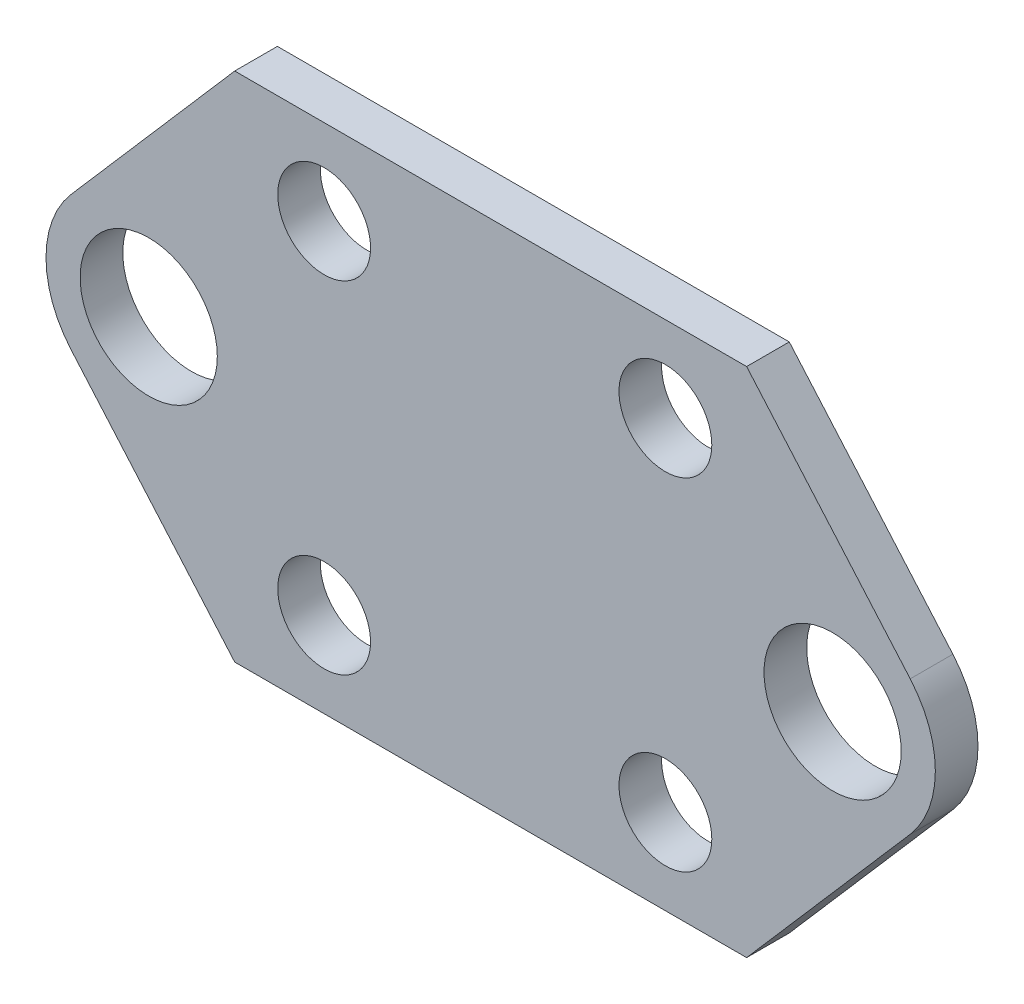
ISO-10303-21;
HEADER;
FILE_DESCRIPTION(('STEP AP214'),'2;1');
FILE_NAME('part.step','',(''),(''),'','','');
FILE_SCHEMA(('AUTOMOTIVE_DESIGN { 1 0 10303 214 1 1 1 1 }'));
ENDSEC;
DATA;
#1=APPLICATION_CONTEXT('core data for automotive mechanical design processes');
#2=APPLICATION_PROTOCOL_DEFINITION('international standard','automotive_design',2000,#1);
#3=PRODUCT_CONTEXT('',#1,'mechanical');
#4=PRODUCT('Part','Part','',(#3));
#5=PRODUCT_RELATED_PRODUCT_CATEGORY('part','',(#4));
#6=PRODUCT_DEFINITION_FORMATION('','',#4);
#7=PRODUCT_DEFINITION_CONTEXT('part definition',#1,'design');
#8=PRODUCT_DEFINITION('design','',#6,#7);
#9=PRODUCT_DEFINITION_SHAPE('','',#8);
#10=(LENGTH_UNIT() NAMED_UNIT(*) SI_UNIT(.MILLI.,.METRE.));
#11=(NAMED_UNIT(*) PLANE_ANGLE_UNIT() SI_UNIT($,.RADIAN.));
#12=(NAMED_UNIT(*) SI_UNIT($,.STERADIAN.) SOLID_ANGLE_UNIT());
#13=UNCERTAINTY_MEASURE_WITH_UNIT(LENGTH_MEASURE(1.E-05),#10,'distance_accuracy_value','');
#14=(GEOMETRIC_REPRESENTATION_CONTEXT(3) GLOBAL_UNCERTAINTY_ASSIGNED_CONTEXT((#13)) GLOBAL_UNIT_ASSIGNED_CONTEXT((#10,
#11,#12)) REPRESENTATION_CONTEXT('',''));
#15=CARTESIAN_POINT('',(0.,0.,0.));
#16=DIRECTION('',(0.,0.,1.));
#17=DIRECTION('',(1.,0.,0.));
#18=AXIS2_PLACEMENT_3D('',#15,#16,#17);
#19=CARTESIAN_POINT('',(-10.1509508913953,-8.80321893244519,0.79375));
#20=DIRECTION('',(0.755478050282948,0.655173958228404,0.));
#21=DIRECTION('',(-0.655173958228405,0.755478050282948,0.));
#22=AXIS2_PLACEMENT_3D('',#19,#20,#21);
#23=PLANE('',#22);
#24=DIRECTION('',(0.655173958228405,-0.755478050282948,0.));
#25=VECTOR('',#24,1.);
#26=CARTESIAN_POINT('',(-10.1509508913953,-8.80321893244519,-0.79375));
#27=LINE('',#26,#25);
#28=CARTESIAN_POINT('',(-15.6133659428166,-2.50453349011973,-0.79375));
#29=VERTEX_POINT('',#28);
#30=CARTESIAN_POINT('',(-9.525,-9.525,-0.79375));
#31=VERTEX_POINT('',#30);
#32=EDGE_CURVE('E167',#29,#31,#27,.T.);
#33=ORIENTED_EDGE('',*,*,#32,.T.);
#34=DIRECTION('',(0.,0.,-1.));
#35=VECTOR('',#34,1.);
#36=CARTESIAN_POINT('',(-9.525,-9.525,0.79375));
#37=LINE('',#36,#35);
#38=CARTESIAN_POINT('',(-9.525,-9.525,0.79375));
#39=VERTEX_POINT('',#38);
#40=EDGE_CURVE('E11',#39,#31,#37,.T.);
#41=ORIENTED_EDGE('',*,*,#40,.F.);
#42=DIRECTION('',(0.655173958228405,-0.755478050282948,0.));
#43=VECTOR('',#42,1.);
#44=CARTESIAN_POINT('',(-10.1509508913953,-8.80321893244519,0.79375));
#45=LINE('',#44,#43);
#46=CARTESIAN_POINT('',(-15.6133659428166,-2.50453349011973,0.79375));
#47=VERTEX_POINT('',#46);
#48=EDGE_CURVE('E250',#47,#39,#45,.T.);
#49=ORIENTED_EDGE('',*,*,#48,.F.);
#50=DIRECTION('',(0.,0.,-1.));
#51=VECTOR('',#50,1.);
#52=CARTESIAN_POINT('',(-15.6133659428166,-2.50453349011973,0.79375));
#53=LINE('',#52,#51);
#54=EDGE_CURVE('E162',#47,#29,#53,.T.);
#55=ORIENTED_EDGE('',*,*,#54,.T.);
#56=EDGE_LOOP('',(#33,#41,#49,#55));
#57=FACE_BOUND('',#56,.T.);
#58=ADVANCED_FACE('F41',(#57),#23,.F.);
#59=CARTESIAN_POINT('',(0.,-9.525,0.79375));
#60=DIRECTION('',(0.,1.,0.));
#61=DIRECTION('',(0.,0.,1.));
#62=AXIS2_PLACEMENT_3D('',#59,#60,#61);
#63=PLANE('',#62);
#64=DIRECTION('',(1.,0.,0.));
#65=VECTOR('',#64,1.);
#66=CARTESIAN_POINT('',(0.,-9.525,-0.79375));
#67=LINE('',#66,#65);
#68=CARTESIAN_POINT('',(9.525,-9.525,-0.79375));
#69=VERTEX_POINT('',#68);
#70=EDGE_CURVE('E171',#31,#69,#67,.T.);
#71=ORIENTED_EDGE('',*,*,#70,.T.);
#72=DIRECTION('',(0.,0.,-1.));
#73=VECTOR('',#72,1.);
#74=CARTESIAN_POINT('',(9.525,-9.525,0.79375));
#75=LINE('',#74,#73);
#76=CARTESIAN_POINT('',(9.525,-9.525,0.79375));
#77=VERTEX_POINT('',#76);
#78=EDGE_CURVE('E51',#77,#69,#75,.T.);
#79=ORIENTED_EDGE('',*,*,#78,.F.);
#80=DIRECTION('',(1.,0.,0.));
#81=VECTOR('',#80,1.);
#82=CARTESIAN_POINT('',(0.,-9.525,0.79375));
#83=LINE('',#82,#81);
#84=EDGE_CURVE('E98',#39,#77,#83,.T.);
#85=ORIENTED_EDGE('',*,*,#84,.F.);
#86=ORIENTED_EDGE('',*,*,#40,.T.);
#87=EDGE_LOOP('',(#71,#79,#85,#86));
#88=FACE_BOUND('',#87,.T.);
#89=ADVANCED_FACE('F233',(#88),#63,.F.);
#90=CARTESIAN_POINT('',(10.1509508913953,-8.80321893244518,0.79375));
#91=DIRECTION('',(0.755478050282949,-0.655173958228404,0.));
#92=DIRECTION('',(0.655173958228404,0.755478050282949,0.));
#93=AXIS2_PLACEMENT_3D('',#90,#91,#92);
#94=PLANE('',#93);
#95=DIRECTION('',(-0.655173958228404,-0.755478050282949,0.));
#96=VECTOR('',#95,1.);
#97=CARTESIAN_POINT('',(10.1509508913953,-8.80321893244518,-0.79375));
#98=LINE('',#97,#96);
#99=CARTESIAN_POINT('',(15.6133659428166,-2.50453349011972,-0.79375));
#100=VERTEX_POINT('',#99);
#101=EDGE_CURVE('E175',#100,#69,#98,.T.);
#102=ORIENTED_EDGE('',*,*,#101,.F.);
#103=DIRECTION('',(0.,0.,-1.));
#104=VECTOR('',#103,1.);
#105=CARTESIAN_POINT('',(15.6133659428166,-2.50453349011972,0.79375));
#106=LINE('',#105,#104);
#107=CARTESIAN_POINT('',(15.6133659428166,-2.50453349011972,0.79375));
#108=VERTEX_POINT('',#107);
#109=EDGE_CURVE('E224',#108,#100,#106,.T.);
#110=ORIENTED_EDGE('',*,*,#109,.F.);
#111=DIRECTION('',(-0.655173958228404,-0.755478050282949,0.));
#112=VECTOR('',#111,1.);
#113=CARTESIAN_POINT('',(10.1509508913953,-8.80321893244518,0.79375));
#114=LINE('',#113,#112);
#115=EDGE_CURVE('E232',#108,#77,#114,.T.);
#116=ORIENTED_EDGE('',*,*,#115,.T.);
#117=ORIENTED_EDGE('',*,*,#78,.T.);
#118=EDGE_LOOP('',(#102,#110,#116,#117));
#119=FACE_BOUND('',#118,.T.);
#120=ADVANCED_FACE('F230',(#119),#94,.T.);
#121=CARTESIAN_POINT('',(12.7254,0.,0.79375));
#122=DIRECTION('',(0.,0.,-1.));
#123=DIRECTION('',(-1.,0.,0.));
#124=AXIS2_PLACEMENT_3D('',#121,#122,#123);
#125=CYLINDRICAL_SURFACE('',#124,3.8227);
#126=CARTESIAN_POINT('',(12.7254,0.,-0.79375));
#127=DIRECTION('',(0.,0.,1.));
#128=DIRECTION('',(1.,0.,0.));
#129=AXIS2_PLACEMENT_3D('',#126,#127,#128);
#130=CIRCLE('',#129,3.8227);
#131=CARTESIAN_POINT('',(15.6133659428166,2.50453349011973,-0.79375));
#132=VERTEX_POINT('',#131);
#133=EDGE_CURVE('E179',#132,#100,#130,.F.);
#134=ORIENTED_EDGE('',*,*,#133,.F.);
#135=DIRECTION('',(0.,0.,-1.));
#136=VECTOR('',#135,1.);
#137=CARTESIAN_POINT('',(15.6133659428166,2.50453349011973,0.79375));
#138=LINE('',#137,#136);
#139=CARTESIAN_POINT('',(15.6133659428166,2.50453349011973,0.79375));
#140=VERTEX_POINT('',#139);
#141=EDGE_CURVE('E221',#140,#132,#138,.T.);
#142=ORIENTED_EDGE('',*,*,#141,.F.);
#143=CARTESIAN_POINT('',(12.7254,0.,0.79375));
#144=DIRECTION('',(0.,0.,1.));
#145=DIRECTION('',(1.,0.,0.));
#146=AXIS2_PLACEMENT_3D('',#143,#144,#145);
#147=CIRCLE('',#146,3.8227);
#148=EDGE_CURVE('E244',#140,#108,#147,.F.);
#149=ORIENTED_EDGE('',*,*,#148,.T.);
#150=ORIENTED_EDGE('',*,*,#109,.T.);
#151=EDGE_LOOP('',(#134,#142,#149,#150));
#152=FACE_BOUND('',#151,.T.);
#153=ADVANCED_FACE('F242',(#152),#125,.T.);
#154=CARTESIAN_POINT('',(10.1509508913953,8.80321893244518,0.79375));
#155=DIRECTION('',(-0.755478050282949,-0.655173958228404,0.));
#156=DIRECTION('',(0.655173958228404,-0.755478050282949,0.));
#157=AXIS2_PLACEMENT_3D('',#154,#155,#156);
#158=PLANE('',#157);
#159=DIRECTION('',(-0.655173958228404,0.755478050282949,0.));
#160=VECTOR('',#159,1.);
#161=CARTESIAN_POINT('',(10.1509508913953,8.80321893244518,-0.79375));
#162=LINE('',#161,#160);
#163=CARTESIAN_POINT('',(9.525,9.525,-0.79375));
#164=VERTEX_POINT('',#163);
#165=EDGE_CURVE('E183',#132,#164,#162,.T.);
#166=ORIENTED_EDGE('',*,*,#165,.T.);
#167=DIRECTION('',(0.,0.,-1.));
#168=VECTOR('',#167,1.);
#169=CARTESIAN_POINT('',(9.525,9.525,0.79375));
#170=LINE('',#169,#168);
#171=CARTESIAN_POINT('',(9.525,9.525,0.79375));
#172=VERTEX_POINT('',#171);
#173=EDGE_CURVE('E124',#172,#164,#170,.T.);
#174=ORIENTED_EDGE('',*,*,#173,.F.);
#175=DIRECTION('',(-0.655173958228404,0.755478050282949,0.));
#176=VECTOR('',#175,1.);
#177=CARTESIAN_POINT('',(10.1509508913953,8.80321893244518,0.79375));
#178=LINE('',#177,#176);
#179=EDGE_CURVE('E131',#140,#172,#178,.T.);
#180=ORIENTED_EDGE('',*,*,#179,.F.);
#181=ORIENTED_EDGE('',*,*,#141,.T.);
#182=EDGE_LOOP('',(#166,#174,#180,#181));
#183=FACE_BOUND('',#182,.T.);
#184=ADVANCED_FACE('F284',(#183),#158,.F.);
#185=CARTESIAN_POINT('',(0.,9.525,0.79375));
#186=DIRECTION('',(0.,1.,0.));
#187=DIRECTION('',(0.,0.,1.));
#188=AXIS2_PLACEMENT_3D('',#185,#186,#187);
#189=PLANE('',#188);
#190=DIRECTION('',(1.,0.,0.));
#191=VECTOR('',#190,1.);
#192=CARTESIAN_POINT('',(0.,9.525,-0.79375));
#193=LINE('',#192,#191);
#194=CARTESIAN_POINT('',(-9.525,9.525,-0.79375));
#195=VERTEX_POINT('',#194);
#196=EDGE_CURVE('E118',#195,#164,#193,.T.);
#197=ORIENTED_EDGE('',*,*,#196,.F.);
#198=DIRECTION('',(0.,0.,-1.));
#199=VECTOR('',#198,1.);
#200=CARTESIAN_POINT('',(-9.525,9.525,0.79375));
#201=LINE('',#200,#199);
#202=CARTESIAN_POINT('',(-9.525,9.525,0.79375));
#203=VERTEX_POINT('',#202);
#204=EDGE_CURVE('E113',#203,#195,#201,.T.);
#205=ORIENTED_EDGE('',*,*,#204,.F.);
#206=DIRECTION('',(1.,0.,0.));
#207=VECTOR('',#206,1.);
#208=CARTESIAN_POINT('',(0.,9.525,0.79375));
#209=LINE('',#208,#207);
#210=EDGE_CURVE('E116',#203,#172,#209,.T.);
#211=ORIENTED_EDGE('',*,*,#210,.T.);
#212=ORIENTED_EDGE('',*,*,#173,.T.);
#213=EDGE_LOOP('',(#197,#205,#211,#212));
#214=FACE_BOUND('',#213,.T.);
#215=ADVANCED_FACE('F115',(#214),#189,.T.);
#216=CARTESIAN_POINT('',(-10.1509508913953,8.80321893244518,0.79375));
#217=DIRECTION('',(-0.755478050282949,0.655173958228404,0.));
#218=DIRECTION('',(-0.655173958228404,-0.755478050282949,0.));
#219=AXIS2_PLACEMENT_3D('',#216,#217,#218);
#220=PLANE('',#219);
#221=DIRECTION('',(0.655173958228404,0.755478050282949,0.));
#222=VECTOR('',#221,1.);
#223=CARTESIAN_POINT('',(-10.1509508913953,8.80321893244518,-0.79375));
#224=LINE('',#223,#222);
#225=CARTESIAN_POINT('',(-15.6133659428166,2.50453349011972,-0.79375));
#226=VERTEX_POINT('',#225);
#227=EDGE_CURVE('E189',#226,#195,#224,.T.);
#228=ORIENTED_EDGE('',*,*,#227,.F.);
#229=DIRECTION('',(0.,0.,-1.));
#230=VECTOR('',#229,1.);
#231=CARTESIAN_POINT('',(-15.6133659428166,2.50453349011972,0.79375));
#232=LINE('',#231,#230);
#233=CARTESIAN_POINT('',(-15.6133659428166,2.50453349011972,0.79375));
#234=VERTEX_POINT('',#233);
#235=EDGE_CURVE('E87',#234,#226,#232,.T.);
#236=ORIENTED_EDGE('',*,*,#235,.F.);
#237=DIRECTION('',(0.655173958228404,0.755478050282949,0.));
#238=VECTOR('',#237,1.);
#239=CARTESIAN_POINT('',(-10.1509508913953,8.80321893244518,0.79375));
#240=LINE('',#239,#238);
#241=EDGE_CURVE('E128',#234,#203,#240,.T.);
#242=ORIENTED_EDGE('',*,*,#241,.T.);
#243=ORIENTED_EDGE('',*,*,#204,.T.);
#244=EDGE_LOOP('',(#228,#236,#242,#243));
#245=FACE_BOUND('',#244,.T.);
#246=ADVANCED_FACE('F135',(#245),#220,.T.);
#247=CARTESIAN_POINT('',(6.5024,-6.35,0.79375));
#248=DIRECTION('',(0.,0.,-1.));
#249=DIRECTION('',(-1.,0.,0.));
#250=AXIS2_PLACEMENT_3D('',#247,#248,#249);
#251=CYLINDRICAL_SURFACE('',#250,1.7272);
#252=CARTESIAN_POINT('',(6.5024,-6.35,0.79375));
#253=DIRECTION('',(0.,0.,1.));
#254=DIRECTION('',(1.,0.,0.));
#255=AXIS2_PLACEMENT_3D('',#252,#253,#254);
#256=CIRCLE('',#255,1.7272);
#257=CARTESIAN_POINT('',(8.2296,-6.35,0.79375));
#258=VERTEX_POINT('',#257);
#259=EDGE_CURVE('E154',#258,#258,#256,.F.);
#260=ORIENTED_EDGE('',*,*,#259,.F.);
#261=EDGE_LOOP('',(#260));
#262=FACE_BOUND('',#261,.T.);
#263=CARTESIAN_POINT('',(6.5024,-6.35,-0.79375));
#264=DIRECTION('',(0.,0.,1.));
#265=DIRECTION('',(1.,0.,0.));
#266=AXIS2_PLACEMENT_3D('',#263,#264,#265);
#267=CIRCLE('',#266,1.7272);
#268=CARTESIAN_POINT('',(8.2296,-6.35,-0.79375));
#269=VERTEX_POINT('',#268);
#270=EDGE_CURVE('E206',#269,#269,#267,.F.);
#271=ORIENTED_EDGE('',*,*,#270,.T.);
#272=EDGE_LOOP('',(#271));
#273=FACE_BOUND('',#272,.T.);
#274=ADVANCED_FACE('F292',(#262,#273),#251,.F.);
#275=CARTESIAN_POINT('',(-6.1976,6.35,0.79375));
#276=DIRECTION('',(0.,0.,-1.));
#277=DIRECTION('',(-1.,0.,0.));
#278=AXIS2_PLACEMENT_3D('',#275,#276,#277);
#279=CYLINDRICAL_SURFACE('',#278,1.7272);
#280=CARTESIAN_POINT('',(-6.1976,6.35,0.79375));
#281=DIRECTION('',(0.,0.,1.));
#282=DIRECTION('',(1.,0.,0.));
#283=AXIS2_PLACEMENT_3D('',#280,#281,#282);
#284=CIRCLE('',#283,1.7272);
#285=CARTESIAN_POINT('',(-4.4704,6.35,0.79375));
#286=VERTEX_POINT('',#285);
#287=EDGE_CURVE('E150',#286,#286,#284,.T.);
#288=ORIENTED_EDGE('',*,*,#287,.T.);
#289=EDGE_LOOP('',(#288));
#290=FACE_BOUND('',#289,.T.);
#291=CARTESIAN_POINT('',(-6.1976,6.35,-0.79375));
#292=DIRECTION('',(0.,0.,1.));
#293=DIRECTION('',(1.,0.,0.));
#294=AXIS2_PLACEMENT_3D('',#291,#292,#293);
#295=CIRCLE('',#294,1.7272);
#296=CARTESIAN_POINT('',(-4.4704,6.35,-0.79375));
#297=VERTEX_POINT('',#296);
#298=EDGE_CURVE('E202',#297,#297,#295,.T.);
#299=ORIENTED_EDGE('',*,*,#298,.F.);
#300=EDGE_LOOP('',(#299));
#301=FACE_BOUND('',#300,.T.);
#302=ADVANCED_FACE('F303',(#290,#301),#279,.F.);
#303=CARTESIAN_POINT('',(6.5024,6.35,0.79375));
#304=DIRECTION('',(0.,0.,-1.));
#305=DIRECTION('',(-1.,0.,0.));
#306=AXIS2_PLACEMENT_3D('',#303,#304,#305);
#307=CYLINDRICAL_SURFACE('',#306,1.7272);
#308=CARTESIAN_POINT('',(6.5024,6.35,0.79375));
#309=DIRECTION('',(0.,0.,1.));
#310=DIRECTION('',(1.,0.,0.));
#311=AXIS2_PLACEMENT_3D('',#308,#309,#310);
#312=CIRCLE('',#311,1.7272);
#313=CARTESIAN_POINT('',(8.2296,6.35,0.79375));
#314=VERTEX_POINT('',#313);
#315=EDGE_CURVE('E146',#314,#314,#312,.T.);
#316=ORIENTED_EDGE('',*,*,#315,.T.);
#317=EDGE_LOOP('',(#316));
#318=FACE_BOUND('',#317,.T.);
#319=CARTESIAN_POINT('',(6.5024,6.35,-0.79375));
#320=DIRECTION('',(0.,0.,1.));
#321=DIRECTION('',(1.,0.,0.));
#322=AXIS2_PLACEMENT_3D('',#319,#320,#321);
#323=CIRCLE('',#322,1.7272);
#324=CARTESIAN_POINT('',(8.2296,6.35,-0.79375));
#325=VERTEX_POINT('',#324);
#326=EDGE_CURVE('E198',#325,#325,#323,.T.);
#327=ORIENTED_EDGE('',*,*,#326,.F.);
#328=EDGE_LOOP('',(#327));
#329=FACE_BOUND('',#328,.T.);
#330=ADVANCED_FACE('F299',(#318,#329),#307,.F.);
#331=CARTESIAN_POINT('',(-6.1976,-6.35000000000001,0.79375));
#332=DIRECTION('',(0.,0.,-1.));
#333=DIRECTION('',(-1.,0.,0.));
#334=AXIS2_PLACEMENT_3D('',#331,#332,#333);
#335=CYLINDRICAL_SURFACE('',#334,1.7272);
#336=CARTESIAN_POINT('',(-6.1976,-6.35000000000001,0.79375));
#337=DIRECTION('',(0.,0.,1.));
#338=DIRECTION('',(1.,0.,0.));
#339=AXIS2_PLACEMENT_3D('',#336,#337,#338);
#340=CIRCLE('',#339,1.7272);
#341=CARTESIAN_POINT('',(-4.4704,-6.35000000000001,0.79375));
#342=VERTEX_POINT('',#341);
#343=EDGE_CURVE('E139',#342,#342,#340,.F.);
#344=ORIENTED_EDGE('',*,*,#343,.F.);
#345=EDGE_LOOP('',(#344));
#346=FACE_BOUND('',#345,.T.);
#347=CARTESIAN_POINT('',(-6.1976,-6.35000000000001,-0.79375));
#348=DIRECTION('',(0.,0.,1.));
#349=DIRECTION('',(1.,0.,0.));
#350=AXIS2_PLACEMENT_3D('',#347,#348,#349);
#351=CIRCLE('',#350,1.7272);
#352=CARTESIAN_POINT('',(-4.4704,-6.35000000000001,-0.79375));
#353=VERTEX_POINT('',#352);
#354=EDGE_CURVE('E194',#353,#353,#351,.F.);
#355=ORIENTED_EDGE('',*,*,#354,.T.);
#356=EDGE_LOOP('',(#355));
#357=FACE_BOUND('',#356,.T.);
#358=ADVANCED_FACE('F296',(#346,#357),#335,.F.);
#359=CARTESIAN_POINT('',(-12.7254,0.,0.79375));
#360=DIRECTION('',(0.,0.,-1.));
#361=DIRECTION('',(-1.,0.,0.));
#362=AXIS2_PLACEMENT_3D('',#359,#360,#361);
#363=CYLINDRICAL_SURFACE('',#362,3.8227);
#364=CARTESIAN_POINT('',(-12.7254,0.,-0.79375));
#365=DIRECTION('',(0.,0.,1.));
#366=DIRECTION('',(1.,0.,0.));
#367=AXIS2_PLACEMENT_3D('',#364,#365,#366);
#368=CIRCLE('',#367,3.8227);
#369=EDGE_CURVE('E90',#226,#29,#368,.T.);
#370=ORIENTED_EDGE('',*,*,#369,.T.);
#371=ORIENTED_EDGE('',*,*,#54,.F.);
#372=CARTESIAN_POINT('',(-12.7254,0.,0.79375));
#373=DIRECTION('',(0.,0.,1.));
#374=DIRECTION('',(1.,0.,0.));
#375=AXIS2_PLACEMENT_3D('',#372,#373,#374);
#376=CIRCLE('',#375,3.8227);
#377=EDGE_CURVE('E59',#234,#47,#376,.T.);
#378=ORIENTED_EDGE('',*,*,#377,.F.);
#379=ORIENTED_EDGE('',*,*,#235,.T.);
#380=EDGE_LOOP('',(#370,#371,#378,#379));
#381=FACE_BOUND('',#380,.T.);
#382=ADVANCED_FACE('F293',(#381),#363,.T.);
#383=CARTESIAN_POINT('',(-12.7254,0.,0.79375));
#384=DIRECTION('',(0.,0.,-1.));
#385=DIRECTION('',(-1.,0.,0.));
#386=AXIS2_PLACEMENT_3D('',#383,#384,#385);
#387=CYLINDRICAL_SURFACE('',#386,2.5527);
#388=CARTESIAN_POINT('',(-12.7254,0.,0.79375));
#389=DIRECTION('',(0.,0.,1.));
#390=DIRECTION('',(1.,0.,0.));
#391=AXIS2_PLACEMENT_3D('',#388,#389,#390);
#392=CIRCLE('',#391,2.5527);
#393=CARTESIAN_POINT('',(-10.1727,0.,0.79375));
#394=VERTEX_POINT('',#393);
#395=EDGE_CURVE('E214',#394,#394,#392,.T.);
#396=ORIENTED_EDGE('',*,*,#395,.T.);
#397=EDGE_LOOP('',(#396));
#398=FACE_BOUND('',#397,.T.);
#399=CARTESIAN_POINT('',(-12.7254,0.,-0.79375));
#400=DIRECTION('',(0.,0.,1.));
#401=DIRECTION('',(1.,0.,0.));
#402=AXIS2_PLACEMENT_3D('',#399,#400,#401);
#403=CIRCLE('',#402,2.5527);
#404=CARTESIAN_POINT('',(-10.1727,0.,-0.79375));
#405=VERTEX_POINT('',#404);
#406=EDGE_CURVE('E163',#405,#405,#403,.T.);
#407=ORIENTED_EDGE('',*,*,#406,.F.);
#408=EDGE_LOOP('',(#407));
#409=FACE_BOUND('',#408,.T.);
#410=ADVANCED_FACE('F43',(#398,#409),#387,.F.);
#411=CARTESIAN_POINT('',(12.7254,0.,0.79375));
#412=DIRECTION('',(0.,0.,-1.));
#413=DIRECTION('',(-1.,0.,0.));
#414=AXIS2_PLACEMENT_3D('',#411,#412,#413);
#415=CYLINDRICAL_SURFACE('',#414,2.5527);
#416=CARTESIAN_POINT('',(12.7254,0.,0.79375));
#417=DIRECTION('',(0.,0.,1.));
#418=DIRECTION('',(1.,0.,0.));
#419=AXIS2_PLACEMENT_3D('',#416,#417,#418);
#420=CIRCLE('',#419,2.5527);
#421=CARTESIAN_POINT('',(15.2781,0.,0.79375));
#422=VERTEX_POINT('',#421);
#423=EDGE_CURVE('E158',#422,#422,#420,.F.);
#424=ORIENTED_EDGE('',*,*,#423,.F.);
#425=EDGE_LOOP('',(#424));
#426=FACE_BOUND('',#425,.T.);
#427=CARTESIAN_POINT('',(12.7254,0.,-0.79375));
#428=DIRECTION('',(0.,0.,1.));
#429=DIRECTION('',(1.,0.,0.));
#430=AXIS2_PLACEMENT_3D('',#427,#428,#429);
#431=CIRCLE('',#430,2.5527);
#432=CARTESIAN_POINT('',(15.2781,0.,-0.79375));
#433=VERTEX_POINT('',#432);
#434=EDGE_CURVE('E210',#433,#433,#431,.F.);
#435=ORIENTED_EDGE('',*,*,#434,.T.);
#436=EDGE_LOOP('',(#435));
#437=FACE_BOUND('',#436,.T.);
#438=ADVANCED_FACE('F263',(#426,#437),#415,.F.);
#439=CARTESIAN_POINT('',(0.,0.,0.79375));
#440=DIRECTION('',(0.,0.,1.));
#441=DIRECTION('',(1.,0.,0.));
#442=AXIS2_PLACEMENT_3D('',#439,#440,#441);
#443=PLANE('',#442);
#444=ORIENTED_EDGE('',*,*,#395,.F.);
#445=EDGE_LOOP('',(#444));
#446=FACE_BOUND('',#445,.T.);
#447=ORIENTED_EDGE('',*,*,#48,.T.);
#448=ORIENTED_EDGE('',*,*,#84,.T.);
#449=ORIENTED_EDGE('',*,*,#115,.F.);
#450=ORIENTED_EDGE('',*,*,#148,.F.);
#451=ORIENTED_EDGE('',*,*,#179,.T.);
#452=ORIENTED_EDGE('',*,*,#210,.F.);
#453=ORIENTED_EDGE('',*,*,#241,.F.);
#454=ORIENTED_EDGE('',*,*,#377,.T.);
#455=EDGE_LOOP('',(#447,#448,#449,#450,#451,#452,#453,#454));
#456=FACE_BOUND('',#455,.T.);
#457=ORIENTED_EDGE('',*,*,#343,.T.);
#458=EDGE_LOOP('',(#457));
#459=FACE_BOUND('',#458,.T.);
#460=ORIENTED_EDGE('',*,*,#315,.F.);
#461=EDGE_LOOP('',(#460));
#462=FACE_BOUND('',#461,.T.);
#463=ORIENTED_EDGE('',*,*,#287,.F.);
#464=EDGE_LOOP('',(#463));
#465=FACE_BOUND('',#464,.T.);
#466=ORIENTED_EDGE('',*,*,#259,.T.);
#467=EDGE_LOOP('',(#466));
#468=FACE_BOUND('',#467,.T.);
#469=ORIENTED_EDGE('',*,*,#423,.T.);
#470=EDGE_LOOP('',(#469));
#471=FACE_BOUND('',#470,.T.);
#472=ADVANCED_FACE('F126',(#446,#456,#459,#462,#465,#468,#471),#443,.T.);
#473=CARTESIAN_POINT('',(0.,0.,-0.79375));
#474=DIRECTION('',(0.,0.,1.));
#475=DIRECTION('',(1.,0.,0.));
#476=AXIS2_PLACEMENT_3D('',#473,#474,#475);
#477=PLANE('',#476);
#478=ORIENTED_EDGE('',*,*,#406,.T.);
#479=EDGE_LOOP('',(#478));
#480=FACE_BOUND('',#479,.T.);
#481=ORIENTED_EDGE('',*,*,#32,.F.);
#482=ORIENTED_EDGE('',*,*,#369,.F.);
#483=ORIENTED_EDGE('',*,*,#227,.T.);
#484=ORIENTED_EDGE('',*,*,#196,.T.);
#485=ORIENTED_EDGE('',*,*,#165,.F.);
#486=ORIENTED_EDGE('',*,*,#133,.T.);
#487=ORIENTED_EDGE('',*,*,#101,.T.);
#488=ORIENTED_EDGE('',*,*,#70,.F.);
#489=EDGE_LOOP('',(#481,#482,#483,#484,#485,#486,#487,#488));
#490=FACE_BOUND('',#489,.T.);
#491=ORIENTED_EDGE('',*,*,#354,.F.);
#492=EDGE_LOOP('',(#491));
#493=FACE_BOUND('',#492,.T.);
#494=ORIENTED_EDGE('',*,*,#326,.T.);
#495=EDGE_LOOP('',(#494));
#496=FACE_BOUND('',#495,.T.);
#497=ORIENTED_EDGE('',*,*,#298,.T.);
#498=EDGE_LOOP('',(#497));
#499=FACE_BOUND('',#498,.T.);
#500=ORIENTED_EDGE('',*,*,#270,.F.);
#501=EDGE_LOOP('',(#500));
#502=FACE_BOUND('',#501,.T.);
#503=ORIENTED_EDGE('',*,*,#434,.F.);
#504=EDGE_LOOP('',(#503));
#505=FACE_BOUND('',#504,.T.);
#506=ADVANCED_FACE('F237',(#480,#490,#493,#496,#499,#502,#505),#477,.F.);
#507=CLOSED_SHELL('',(#58,#89,#120,#153,#184,#215,#246,#274,#302,#330,#358,#382,#410,#438,#472,#506));
#508=MANIFOLD_SOLID_BREP('B2',#507);
#509=ADVANCED_BREP_SHAPE_REPRESENTATION('',(#18,#508),#14);
#510=SHAPE_DEFINITION_REPRESENTATION(#9,#509);
ENDSEC;
END-ISO-10303-21;
